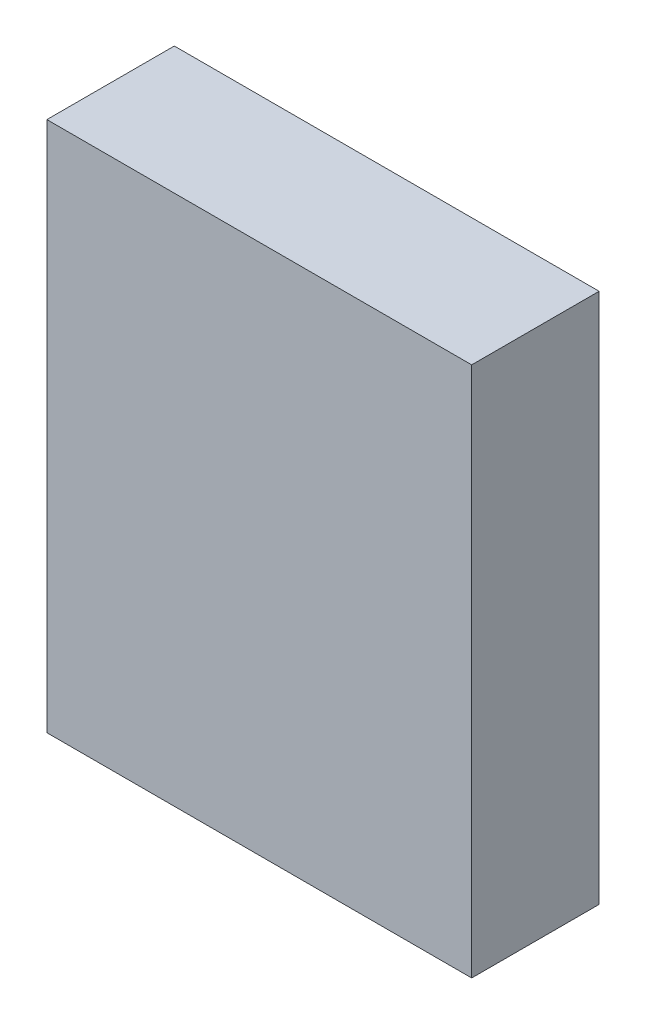
ISO-10303-21;
HEADER;
FILE_DESCRIPTION(('STEP AP214'),'2;1');
FILE_NAME('part.step','',(''),(''),'','','');
FILE_SCHEMA(('AUTOMOTIVE_DESIGN { 1 0 10303 214 1 1 1 1 }'));
ENDSEC;
DATA;
#1=APPLICATION_CONTEXT('core data for automotive mechanical design processes');
#2=APPLICATION_PROTOCOL_DEFINITION('international standard','automotive_design',2000,#1);
#3=PRODUCT_CONTEXT('',#1,'mechanical');
#4=PRODUCT('Part','Part','',(#3));
#5=PRODUCT_RELATED_PRODUCT_CATEGORY('part','',(#4));
#6=PRODUCT_DEFINITION_FORMATION('','',#4);
#7=PRODUCT_DEFINITION_CONTEXT('part definition',#1,'design');
#8=PRODUCT_DEFINITION('design','',#6,#7);
#9=PRODUCT_DEFINITION_SHAPE('','',#8);
#10=(LENGTH_UNIT() NAMED_UNIT(*) SI_UNIT(.MILLI.,.METRE.));
#11=(NAMED_UNIT(*) PLANE_ANGLE_UNIT() SI_UNIT($,.RADIAN.));
#12=(NAMED_UNIT(*) SI_UNIT($,.STERADIAN.) SOLID_ANGLE_UNIT());
#13=UNCERTAINTY_MEASURE_WITH_UNIT(LENGTH_MEASURE(1.E-05),#10,'distance_accuracy_value','');
#14=(GEOMETRIC_REPRESENTATION_CONTEXT(3) GLOBAL_UNCERTAINTY_ASSIGNED_CONTEXT((#13)) GLOBAL_UNIT_ASSIGNED_CONTEXT((#10,
#11,#12)) REPRESENTATION_CONTEXT('',''));
#15=CARTESIAN_POINT('',(0.,0.,0.));
#16=DIRECTION('',(0.,0.,1.));
#17=DIRECTION('',(1.,0.,0.));
#18=AXIS2_PLACEMENT_3D('',#15,#16,#17);
#19=CARTESIAN_POINT('',(-1.00000054,-1.25000004,0.5999988));
#20=DIRECTION('',(0.,0.,-1.));
#21=DIRECTION('',(-1.,0.,0.));
#22=AXIS2_PLACEMENT_3D('',#19,#20,#21);
#23=PLANE('',#22);
#24=DIRECTION('',(0.,1.,0.));
#25=VECTOR('',#24,1.);
#26=CARTESIAN_POINT('',(1.00000054,-1.25000004,0.5999988));
#27=LINE('',#26,#25);
#28=CARTESIAN_POINT('',(1.00000054,-1.25000004,0.5999988));
#29=VERTEX_POINT('',#28);
#30=CARTESIAN_POINT('',(1.00000054,1.25000004,0.5999988));
#31=VERTEX_POINT('',#30);
#32=EDGE_CURVE('E55',#29,#31,#27,.T.);
#33=ORIENTED_EDGE('',*,*,#32,.T.);
#34=DIRECTION('',(1.,0.,0.));
#35=VECTOR('',#34,1.);
#36=CARTESIAN_POINT('',(1.00000054,1.25000004,0.5999988));
#37=LINE('',#36,#35);
#38=CARTESIAN_POINT('',(-1.00000054,1.25000004,0.5999988));
#39=VERTEX_POINT('',#38);
#40=EDGE_CURVE('E57',#31,#39,#37,.F.);
#41=ORIENTED_EDGE('',*,*,#40,.T.);
#42=DIRECTION('',(0.,1.,0.));
#43=VECTOR('',#42,1.);
#44=CARTESIAN_POINT('',(-1.00000054,1.25000004,0.5999988));
#45=LINE('',#44,#43);
#46=CARTESIAN_POINT('',(-1.00000054,-1.25000004,0.5999988));
#47=VERTEX_POINT('',#46);
#48=EDGE_CURVE('E20',#39,#47,#45,.F.);
#49=ORIENTED_EDGE('',*,*,#48,.T.);
#50=DIRECTION('',(1.,0.,0.));
#51=VECTOR('',#50,1.);
#52=CARTESIAN_POINT('',(-1.00000054,-1.25000004,0.5999988));
#53=LINE('',#52,#51);
#54=EDGE_CURVE('E80',#47,#29,#53,.T.);
#55=ORIENTED_EDGE('',*,*,#54,.T.);
#56=EDGE_LOOP('',(#33,#41,#49,#55));
#57=FACE_BOUND('',#56,.T.);
#58=ADVANCED_FACE('F17',(#57),#23,.F.);
#59=CARTESIAN_POINT('',(-1.00000054,1.25000004,0.));
#60=DIRECTION('',(1.,0.,0.));
#61=DIRECTION('',(0.,0.,-1.));
#62=AXIS2_PLACEMENT_3D('',#59,#60,#61);
#63=PLANE('',#62);
#64=DIRECTION('',(0.,0.,1.));
#65=VECTOR('',#64,1.);
#66=CARTESIAN_POINT('',(-1.00000054,-1.25000004,0.));
#67=LINE('',#66,#65);
#68=CARTESIAN_POINT('',(-1.00000054,-1.25000004,0.));
#69=VERTEX_POINT('',#68);
#70=EDGE_CURVE('E68',#69,#47,#67,.T.);
#71=ORIENTED_EDGE('',*,*,#70,.T.);
#72=ORIENTED_EDGE('',*,*,#48,.F.);
#73=DIRECTION('',(0.,0.,-1.));
#74=VECTOR('',#73,1.);
#75=CARTESIAN_POINT('',(-1.00000054,1.25000004,0.));
#76=LINE('',#75,#74);
#77=CARTESIAN_POINT('',(-1.00000054,1.25000004,0.));
#78=VERTEX_POINT('',#77);
#79=EDGE_CURVE('E63',#39,#78,#76,.T.);
#80=ORIENTED_EDGE('',*,*,#79,.T.);
#81=DIRECTION('',(0.,1.,0.));
#82=VECTOR('',#81,1.);
#83=CARTESIAN_POINT('',(-1.00000054,-1.25000004,0.));
#84=LINE('',#83,#82);
#85=EDGE_CURVE('E83',#69,#78,#84,.T.);
#86=ORIENTED_EDGE('',*,*,#85,.F.);
#87=EDGE_LOOP('',(#71,#72,#80,#86));
#88=FACE_BOUND('',#87,.T.);
#89=ADVANCED_FACE('F65',(#88),#63,.F.);
#90=CARTESIAN_POINT('',(1.00000054,1.25000004,0.));
#91=DIRECTION('',(0.,-1.,0.));
#92=DIRECTION('',(0.,0.,-1.));
#93=AXIS2_PLACEMENT_3D('',#90,#91,#92);
#94=PLANE('',#93);
#95=ORIENTED_EDGE('',*,*,#79,.F.);
#96=ORIENTED_EDGE('',*,*,#40,.F.);
#97=DIRECTION('',(0.,0.,1.));
#98=VECTOR('',#97,1.);
#99=CARTESIAN_POINT('',(1.00000054,1.25000004,0.));
#100=LINE('',#99,#98);
#101=CARTESIAN_POINT('',(1.00000054,1.25000004,0.));
#102=VERTEX_POINT('',#101);
#103=EDGE_CURVE('E75',#31,#102,#100,.F.);
#104=ORIENTED_EDGE('',*,*,#103,.T.);
#105=DIRECTION('',(-1.,0.,0.));
#106=VECTOR('',#105,1.);
#107=CARTESIAN_POINT('',(-1.00000054,1.25000004,0.));
#108=LINE('',#107,#106);
#109=EDGE_CURVE('E72',#78,#102,#108,.F.);
#110=ORIENTED_EDGE('',*,*,#109,.F.);
#111=EDGE_LOOP('',(#95,#96,#104,#110));
#112=FACE_BOUND('',#111,.T.);
#113=ADVANCED_FACE('F70',(#112),#94,.F.);
#114=CARTESIAN_POINT('',(1.00000054,-1.25000004,0.));
#115=DIRECTION('',(-1.,0.,0.));
#116=DIRECTION('',(0.,0.,1.));
#117=AXIS2_PLACEMENT_3D('',#114,#115,#116);
#118=PLANE('',#117);
#119=ORIENTED_EDGE('',*,*,#103,.F.);
#120=ORIENTED_EDGE('',*,*,#32,.F.);
#121=DIRECTION('',(0.,0.,1.));
#122=VECTOR('',#121,1.);
#123=CARTESIAN_POINT('',(1.00000054,-1.25000004,0.));
#124=LINE('',#123,#122);
#125=CARTESIAN_POINT('',(1.00000054,-1.25000004,0.));
#126=VERTEX_POINT('',#125);
#127=EDGE_CURVE('E35',#29,#126,#124,.F.);
#128=ORIENTED_EDGE('',*,*,#127,.T.);
#129=DIRECTION('',(0.,1.,0.));
#130=VECTOR('',#129,1.);
#131=CARTESIAN_POINT('',(1.00000054,-1.25000004,0.));
#132=LINE('',#131,#130);
#133=EDGE_CURVE('E26',#102,#126,#132,.F.);
#134=ORIENTED_EDGE('',*,*,#133,.F.);
#135=EDGE_LOOP('',(#119,#120,#128,#134));
#136=FACE_BOUND('',#135,.T.);
#137=ADVANCED_FACE('F89',(#136),#118,.F.);
#138=CARTESIAN_POINT('',(-1.00000054,-1.25000004,0.));
#139=DIRECTION('',(0.,1.,0.));
#140=DIRECTION('',(0.,0.,1.));
#141=AXIS2_PLACEMENT_3D('',#138,#139,#140);
#142=PLANE('',#141);
#143=ORIENTED_EDGE('',*,*,#127,.F.);
#144=ORIENTED_EDGE('',*,*,#54,.F.);
#145=ORIENTED_EDGE('',*,*,#70,.F.);
#146=DIRECTION('',(-1.,0.,0.));
#147=VECTOR('',#146,1.);
#148=CARTESIAN_POINT('',(-1.00000054,-1.25000004,0.));
#149=LINE('',#148,#147);
#150=EDGE_CURVE('E11',#126,#69,#149,.T.);
#151=ORIENTED_EDGE('',*,*,#150,.F.);
#152=EDGE_LOOP('',(#143,#144,#145,#151));
#153=FACE_BOUND('',#152,.T.);
#154=ADVANCED_FACE('F91',(#153),#142,.F.);
#155=CARTESIAN_POINT('',(-1.00000054,-1.25000004,0.));
#156=DIRECTION('',(0.,0.,-1.));
#157=DIRECTION('',(-1.,0.,0.));
#158=AXIS2_PLACEMENT_3D('',#155,#156,#157);
#159=PLANE('',#158);
#160=ORIENTED_EDGE('',*,*,#133,.T.);
#161=ORIENTED_EDGE('',*,*,#150,.T.);
#162=ORIENTED_EDGE('',*,*,#85,.T.);
#163=ORIENTED_EDGE('',*,*,#109,.T.);
#164=EDGE_LOOP('',(#160,#161,#162,#163));
#165=FACE_BOUND('',#164,.T.);
#166=ADVANCED_FACE('F88',(#165),#159,.T.);
#167=CLOSED_SHELL('',(#58,#89,#113,#137,#154,#166));
#168=MANIFOLD_SOLID_BREP('B1',#167);
#169=ADVANCED_BREP_SHAPE_REPRESENTATION('',(#18,#168),#14);
#170=SHAPE_DEFINITION_REPRESENTATION(#9,#169);
ENDSEC;
END-ISO-10303-21;
